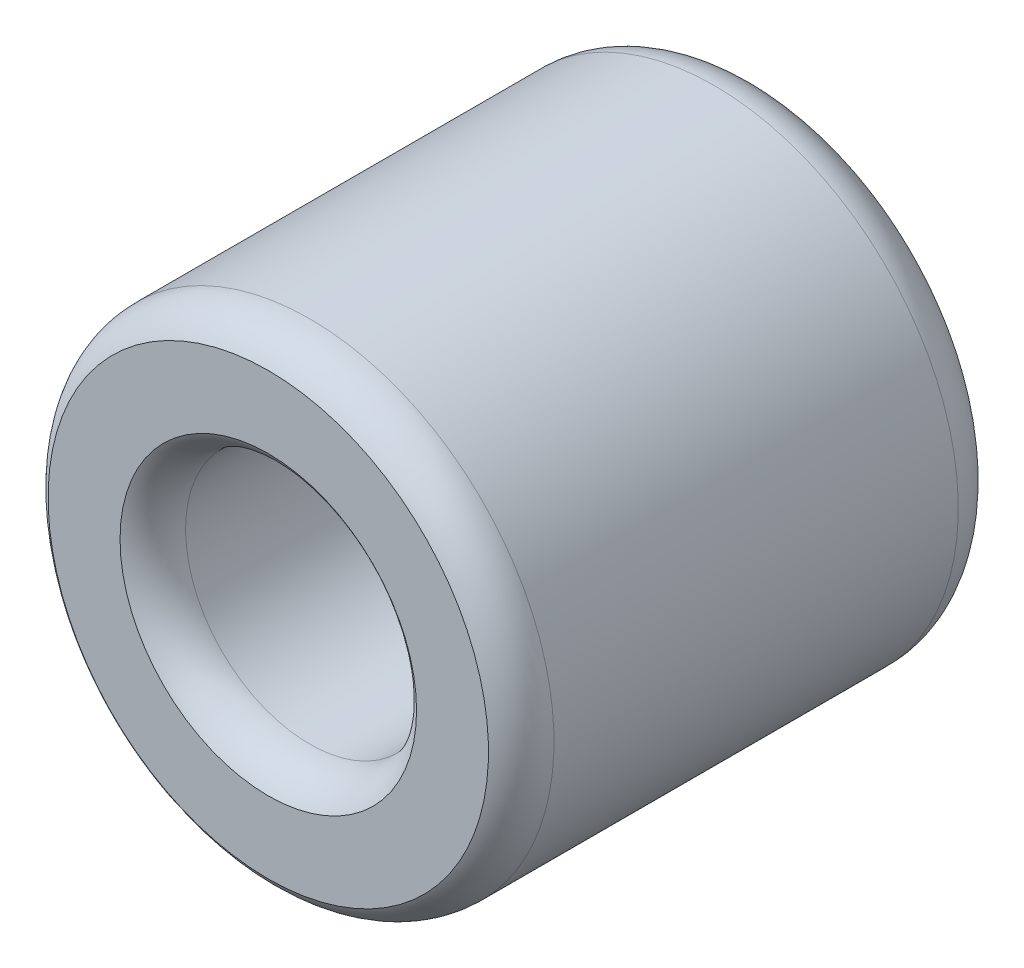
ISO-10303-21;
HEADER;
FILE_DESCRIPTION(('STEP AP214'),'2;1');
FILE_NAME('part.step','',(''),(''),'','','');
FILE_SCHEMA(('AUTOMOTIVE_DESIGN { 1 0 10303 214 1 1 1 1 }'));
ENDSEC;
DATA;
#1=APPLICATION_CONTEXT('core data for automotive mechanical design processes');
#2=APPLICATION_PROTOCOL_DEFINITION('international standard','automotive_design',2000,#1);
#3=PRODUCT_CONTEXT('',#1,'mechanical');
#4=PRODUCT('Part','Part','',(#3));
#5=PRODUCT_RELATED_PRODUCT_CATEGORY('part','',(#4));
#6=PRODUCT_DEFINITION_FORMATION('','',#4);
#7=PRODUCT_DEFINITION_CONTEXT('part definition',#1,'design');
#8=PRODUCT_DEFINITION('design','',#6,#7);
#9=PRODUCT_DEFINITION_SHAPE('','',#8);
#10=(LENGTH_UNIT() NAMED_UNIT(*) SI_UNIT(.MILLI.,.METRE.));
#11=(NAMED_UNIT(*) PLANE_ANGLE_UNIT() SI_UNIT($,.RADIAN.));
#12=(NAMED_UNIT(*) SI_UNIT($,.STERADIAN.) SOLID_ANGLE_UNIT());
#13=UNCERTAINTY_MEASURE_WITH_UNIT(LENGTH_MEASURE(1.E-05),#10,'distance_accuracy_value','');
#14=(GEOMETRIC_REPRESENTATION_CONTEXT(3) GLOBAL_UNCERTAINTY_ASSIGNED_CONTEXT((#13)) GLOBAL_UNIT_ASSIGNED_CONTEXT((#10,
#11,#12)) REPRESENTATION_CONTEXT('',''));
#15=CARTESIAN_POINT('',(0.,0.,0.));
#16=DIRECTION('',(0.,0.,1.));
#17=DIRECTION('',(1.,0.,0.));
#18=AXIS2_PLACEMENT_3D('',#15,#16,#17);
#19=CARTESIAN_POINT('',(0.,0.,3.175));
#20=DIRECTION('',(0.,0.,-1.));
#21=DIRECTION('',(-1.,0.,0.));
#22=AXIS2_PLACEMENT_3D('',#19,#20,#21);
#23=CYLINDRICAL_SURFACE('',#22,3.18135);
#24=CARTESIAN_POINT('',(0.,0.,2.63387268669933));
#25=DIRECTION('',(0.,0.,-1.));
#26=DIRECTION('',(0.,1.,0.));
#27=AXIS2_PLACEMENT_3D('',#24,#25,#26);
#28=CIRCLE('',#27,3.18135);
#29=CARTESIAN_POINT('',(0.,3.18135,2.63387268669933));
#30=VERTEX_POINT('',#29);
#31=EDGE_CURVE('E61',#30,#30,#28,.T.);
#32=ORIENTED_EDGE('',*,*,#31,.T.);
#33=EDGE_LOOP('',(#32));
#34=FACE_BOUND('',#33,.T.);
#35=CARTESIAN_POINT('',(0.,0.,-2.63387268669934));
#36=DIRECTION('',(0.,0.,-1.));
#37=DIRECTION('',(0.,1.,0.));
#38=AXIS2_PLACEMENT_3D('',#35,#36,#37);
#39=CIRCLE('',#38,3.18135);
#40=CARTESIAN_POINT('',(0.,3.18135,-2.63387268669934));
#41=VERTEX_POINT('',#40);
#42=EDGE_CURVE('E80',#41,#41,#39,.T.);
#43=ORIENTED_EDGE('',*,*,#42,.F.);
#44=EDGE_LOOP('',(#43));
#45=FACE_BOUND('',#44,.T.);
#46=ADVANCED_FACE('F41',(#34,#45),#23,.T.);
#47=CARTESIAN_POINT('',(0.,0.,-2.63387268669934));
#48=DIRECTION('',(0.,0.,-1.));
#49=DIRECTION('',(0.,1.,0.));
#50=AXIS2_PLACEMENT_3D('',#47,#48,#49);
#51=TOROIDAL_SURFACE('',#50,2.55651,0.624840000000001);
#52=CARTESIAN_POINT('',(0.,0.,-3.17500000000001));
#53=DIRECTION('',(0.,0.,-1.));
#54=DIRECTION('',(0.,1.,0.));
#55=AXIS2_PLACEMENT_3D('',#52,#53,#54);
#56=CIRCLE('',#55,2.86893);
#57=CARTESIAN_POINT('',(0.,2.86893,-3.175));
#58=VERTEX_POINT('',#57);
#59=EDGE_CURVE('E69',#58,#58,#56,.T.);
#60=ORIENTED_EDGE('',*,*,#59,.F.);
#61=EDGE_LOOP('',(#60));
#62=FACE_BOUND('',#61,.T.);
#63=ORIENTED_EDGE('',*,*,#42,.T.);
#64=EDGE_LOOP('',(#63));
#65=FACE_BOUND('',#64,.T.);
#66=ADVANCED_FACE('F81',(#62,#65),#51,.T.);
#67=CARTESIAN_POINT('',(0.,0.,2.63387268669933));
#68=DIRECTION('',(0.,0.,-1.));
#69=DIRECTION('',(0.,1.,0.));
#70=AXIS2_PLACEMENT_3D('',#67,#68,#69);
#71=TOROIDAL_SURFACE('',#70,2.55651,0.624840000000001);
#72=ORIENTED_EDGE('',*,*,#31,.F.);
#73=EDGE_LOOP('',(#72));
#74=FACE_BOUND('',#73,.T.);
#75=CARTESIAN_POINT('',(0.,0.,3.175));
#76=DIRECTION('',(0.,0.,-1.));
#77=DIRECTION('',(0.,1.,0.));
#78=AXIS2_PLACEMENT_3D('',#75,#76,#77);
#79=CIRCLE('',#78,2.86893);
#80=CARTESIAN_POINT('',(0.,2.86893,3.175));
#81=VERTEX_POINT('',#80);
#82=EDGE_CURVE('E70',#81,#81,#79,.T.);
#83=ORIENTED_EDGE('',*,*,#82,.T.);
#84=EDGE_LOOP('',(#83));
#85=FACE_BOUND('',#84,.T.);
#86=ADVANCED_FACE('F93',(#74,#85),#71,.T.);
#87=CARTESIAN_POINT('',(0.,0.,-3.175));
#88=DIRECTION('',(0.,0.,1.));
#89=DIRECTION('',(1.,0.,0.));
#90=AXIS2_PLACEMENT_3D('',#87,#88,#89);
#91=PLANE('',#90);
#92=ORIENTED_EDGE('',*,*,#59,.T.);
#93=EDGE_LOOP('',(#92));
#94=FACE_BOUND('',#93,.T.);
#95=CARTESIAN_POINT('',(0.,0.,-3.175));
#96=DIRECTION('',(0.,0.,-1.));
#97=DIRECTION('',(0.,1.,0.));
#98=AXIS2_PLACEMENT_3D('',#95,#96,#97);
#99=CIRCLE('',#98,1.93167);
#100=CARTESIAN_POINT('',(0.,1.93167,-3.175));
#101=VERTEX_POINT('',#100);
#102=EDGE_CURVE('E53',#101,#101,#99,.T.);
#103=ORIENTED_EDGE('',*,*,#102,.F.);
#104=EDGE_LOOP('',(#103));
#105=FACE_BOUND('',#104,.T.);
#106=ADVANCED_FACE('F98',(#94,#105),#91,.F.);
#107=CARTESIAN_POINT('',(0.,0.,3.175));
#108=DIRECTION('',(0.,0.,1.));
#109=DIRECTION('',(1.,0.,0.));
#110=AXIS2_PLACEMENT_3D('',#107,#108,#109);
#111=PLANE('',#110);
#112=ORIENTED_EDGE('',*,*,#82,.F.);
#113=EDGE_LOOP('',(#112));
#114=FACE_BOUND('',#113,.T.);
#115=CARTESIAN_POINT('',(0.,0.,3.175));
#116=DIRECTION('',(0.,0.,-1.));
#117=DIRECTION('',(0.,1.,0.));
#118=AXIS2_PLACEMENT_3D('',#115,#116,#117);
#119=CIRCLE('',#118,1.93167);
#120=CARTESIAN_POINT('',(0.,1.93167,3.175));
#121=VERTEX_POINT('',#120);
#122=EDGE_CURVE('E10',#121,#121,#119,.T.);
#123=ORIENTED_EDGE('',*,*,#122,.T.);
#124=EDGE_LOOP('',(#123));
#125=FACE_BOUND('',#124,.T.);
#126=ADVANCED_FACE('F105',(#114,#125),#111,.T.);
#127=CARTESIAN_POINT('',(0.,0.,2.63387268669933));
#128=DIRECTION('',(0.,0.,-1.));
#129=DIRECTION('',(0.,1.,0.));
#130=AXIS2_PLACEMENT_3D('',#127,#128,#129);
#131=TOROIDAL_SURFACE('',#130,2.24409,0.624840000000001);
#132=ORIENTED_EDGE('',*,*,#122,.F.);
#133=EDGE_LOOP('',(#132));
#134=FACE_BOUND('',#133,.T.);
#135=CARTESIAN_POINT('',(0.,0.,2.63387268669933));
#136=DIRECTION('',(0.,0.,-1.));
#137=DIRECTION('',(0.,1.,0.));
#138=AXIS2_PLACEMENT_3D('',#135,#136,#137);
#139=CIRCLE('',#138,1.61925);
#140=CARTESIAN_POINT('',(0.,1.61925,2.63387268669933));
#141=VERTEX_POINT('',#140);
#142=EDGE_CURVE('E48',#141,#141,#139,.T.);
#143=ORIENTED_EDGE('',*,*,#142,.T.);
#144=EDGE_LOOP('',(#143));
#145=FACE_BOUND('',#144,.T.);
#146=ADVANCED_FACE('F102',(#134,#145),#131,.T.);
#147=CARTESIAN_POINT('',(0.,0.,-2.63387268669934));
#148=DIRECTION('',(0.,0.,-1.));
#149=DIRECTION('',(0.,1.,0.));
#150=AXIS2_PLACEMENT_3D('',#147,#148,#149);
#151=TOROIDAL_SURFACE('',#150,2.24409,0.624840000000001);
#152=CARTESIAN_POINT('',(0.,0.,-2.63387268669933));
#153=DIRECTION('',(0.,0.,-1.));
#154=DIRECTION('',(0.,1.,0.));
#155=AXIS2_PLACEMENT_3D('',#152,#153,#154);
#156=CIRCLE('',#155,1.61925);
#157=CARTESIAN_POINT('',(0.,1.61925,-2.63387268669933));
#158=VERTEX_POINT('',#157);
#159=EDGE_CURVE('E58',#158,#158,#156,.T.);
#160=ORIENTED_EDGE('',*,*,#159,.F.);
#161=EDGE_LOOP('',(#160));
#162=FACE_BOUND('',#161,.T.);
#163=ORIENTED_EDGE('',*,*,#102,.T.);
#164=EDGE_LOOP('',(#163));
#165=FACE_BOUND('',#164,.T.);
#166=ADVANCED_FACE('F109',(#162,#165),#151,.T.);
#167=CARTESIAN_POINT('',(0.,0.,3.175));
#168=DIRECTION('',(0.,0.,-1.));
#169=DIRECTION('',(-1.,0.,0.));
#170=AXIS2_PLACEMENT_3D('',#167,#168,#169);
#171=CYLINDRICAL_SURFACE('',#170,1.61925);
#172=ORIENTED_EDGE('',*,*,#142,.F.);
#173=EDGE_LOOP('',(#172));
#174=FACE_BOUND('',#173,.T.);
#175=ORIENTED_EDGE('',*,*,#159,.T.);
#176=EDGE_LOOP('',(#175));
#177=FACE_BOUND('',#176,.T.);
#178=ADVANCED_FACE('F113',(#174,#177),#171,.F.);
#179=CLOSED_SHELL('',(#46,#66,#86,#106,#126,#146,#166,#178));
#180=MANIFOLD_SOLID_BREP('B2',#179);
#181=ADVANCED_BREP_SHAPE_REPRESENTATION('',(#18,#180),#14);
#182=SHAPE_DEFINITION_REPRESENTATION(#9,#181);
ENDSEC;
END-ISO-10303-21;
